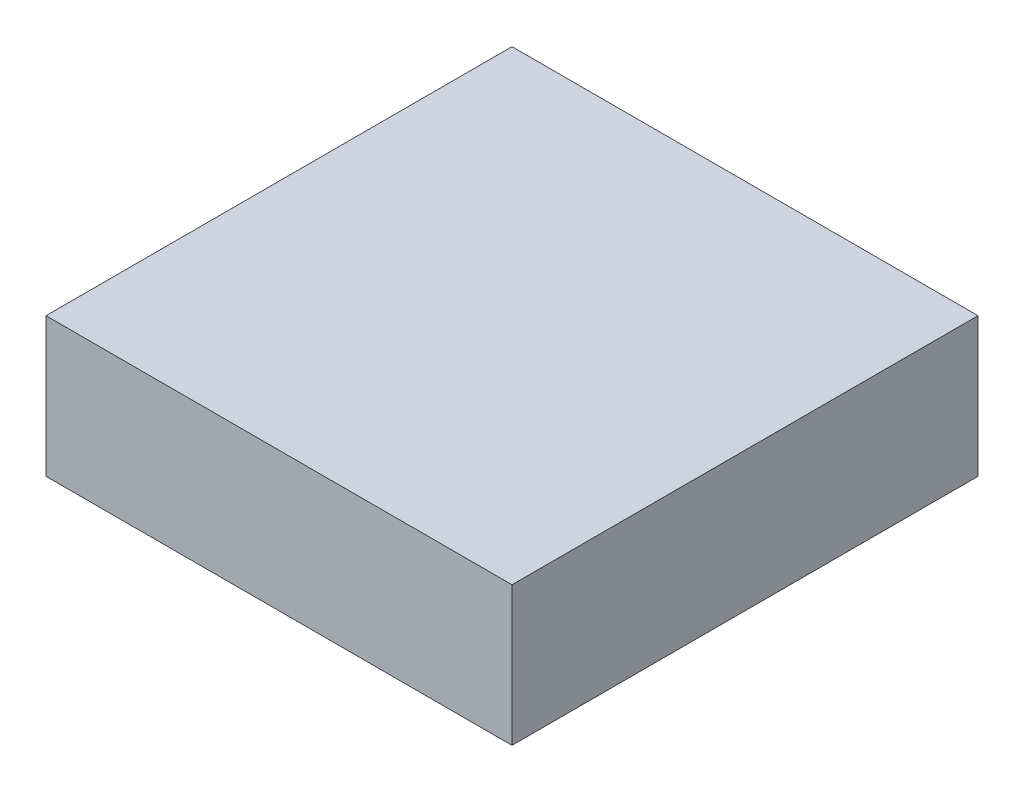
ISO-10303-21;
HEADER;
FILE_DESCRIPTION(('STEP AP214'),'2;1');
FILE_NAME('part.step','',(''),(''),'','','');
FILE_SCHEMA(('AUTOMOTIVE_DESIGN { 1 0 10303 214 1 1 1 1 }'));
ENDSEC;
DATA;
#1=APPLICATION_CONTEXT('core data for automotive mechanical design processes');
#2=APPLICATION_PROTOCOL_DEFINITION('international standard','automotive_design',2000,#1);
#3=PRODUCT_CONTEXT('',#1,'mechanical');
#4=PRODUCT('Part','Part','',(#3));
#5=PRODUCT_RELATED_PRODUCT_CATEGORY('part','',(#4));
#6=PRODUCT_DEFINITION_FORMATION('','',#4);
#7=PRODUCT_DEFINITION_CONTEXT('part definition',#1,'design');
#8=PRODUCT_DEFINITION('design','',#6,#7);
#9=PRODUCT_DEFINITION_SHAPE('','',#8);
#10=(LENGTH_UNIT() NAMED_UNIT(*) SI_UNIT(.MILLI.,.METRE.));
#11=(NAMED_UNIT(*) PLANE_ANGLE_UNIT() SI_UNIT($,.RADIAN.));
#12=(NAMED_UNIT(*) SI_UNIT($,.STERADIAN.) SOLID_ANGLE_UNIT());
#13=UNCERTAINTY_MEASURE_WITH_UNIT(LENGTH_MEASURE(1.E-05),#10,'distance_accuracy_value','');
#14=(GEOMETRIC_REPRESENTATION_CONTEXT(3) GLOBAL_UNCERTAINTY_ASSIGNED_CONTEXT((#13)) GLOBAL_UNIT_ASSIGNED_CONTEXT((#10,
#11,#12)) REPRESENTATION_CONTEXT('',''));
#15=CARTESIAN_POINT('',(0.,0.,0.));
#16=DIRECTION('',(0.,0.,1.));
#17=DIRECTION('',(1.,0.,0.));
#18=AXIS2_PLACEMENT_3D('',#15,#16,#17);
#19=CARTESIAN_POINT('',(0.,50.8,0.));
#20=DIRECTION('',(1.,0.,0.));
#21=DIRECTION('',(0.,0.,-1.));
#22=AXIS2_PLACEMENT_3D('',#19,#20,#21);
#23=PLANE('',#22);
#24=DIRECTION('',(0.,0.,1.));
#25=VECTOR('',#24,1.);
#26=CARTESIAN_POINT('',(0.,0.,0.));
#27=LINE('',#26,#25);
#28=CARTESIAN_POINT('',(0.,0.,-170.18));
#29=VERTEX_POINT('',#28);
#30=CARTESIAN_POINT('',(0.,0.,0.));
#31=VERTEX_POINT('',#30);
#32=EDGE_CURVE('E96',#29,#31,#27,.T.);
#33=ORIENTED_EDGE('',*,*,#32,.T.);
#34=DIRECTION('',(0.,-1.,0.));
#35=VECTOR('',#34,1.);
#36=CARTESIAN_POINT('',(0.,50.8,0.));
#37=LINE('',#36,#35);
#38=CARTESIAN_POINT('',(0.,50.8,0.));
#39=VERTEX_POINT('',#38);
#40=EDGE_CURVE('E11',#39,#31,#37,.T.);
#41=ORIENTED_EDGE('',*,*,#40,.F.);
#42=DIRECTION('',(0.,0.,1.));
#43=VECTOR('',#42,1.);
#44=CARTESIAN_POINT('',(0.,50.8,0.));
#45=LINE('',#44,#43);
#46=CARTESIAN_POINT('',(0.,50.8,-170.18));
#47=VERTEX_POINT('',#46);
#48=EDGE_CURVE('E84',#47,#39,#45,.T.);
#49=ORIENTED_EDGE('',*,*,#48,.F.);
#50=DIRECTION('',(0.,-1.,0.));
#51=VECTOR('',#50,1.);
#52=CARTESIAN_POINT('',(0.,50.8,-170.18));
#53=LINE('',#52,#51);
#54=EDGE_CURVE('E92',#47,#29,#53,.T.);
#55=ORIENTED_EDGE('',*,*,#54,.T.);
#56=EDGE_LOOP('',(#33,#41,#49,#55));
#57=FACE_BOUND('',#56,.T.);
#58=ADVANCED_FACE('F33',(#57),#23,.F.);
#59=CARTESIAN_POINT('',(0.,50.8,0.));
#60=DIRECTION('',(0.,0.,-1.));
#61=DIRECTION('',(-1.,0.,0.));
#62=AXIS2_PLACEMENT_3D('',#59,#60,#61);
#63=PLANE('',#62);
#64=DIRECTION('',(1.,0.,0.));
#65=VECTOR('',#64,1.);
#66=CARTESIAN_POINT('',(0.,0.,0.));
#67=LINE('',#66,#65);
#68=CARTESIAN_POINT('',(170.18,0.,0.));
#69=VERTEX_POINT('',#68);
#70=EDGE_CURVE('E88',#31,#69,#67,.T.);
#71=ORIENTED_EDGE('',*,*,#70,.T.);
#72=DIRECTION('',(0.,-1.,0.));
#73=VECTOR('',#72,1.);
#74=CARTESIAN_POINT('',(170.18,50.8,0.));
#75=LINE('',#74,#73);
#76=CARTESIAN_POINT('',(170.18,50.8,0.));
#77=VERTEX_POINT('',#76);
#78=EDGE_CURVE('E41',#77,#69,#75,.T.);
#79=ORIENTED_EDGE('',*,*,#78,.F.);
#80=DIRECTION('',(1.,0.,0.));
#81=VECTOR('',#80,1.);
#82=CARTESIAN_POINT('',(0.,50.8,0.));
#83=LINE('',#82,#81);
#84=EDGE_CURVE('E79',#39,#77,#83,.T.);
#85=ORIENTED_EDGE('',*,*,#84,.F.);
#86=ORIENTED_EDGE('',*,*,#40,.T.);
#87=EDGE_LOOP('',(#71,#79,#85,#86));
#88=FACE_BOUND('',#87,.T.);
#89=ADVANCED_FACE('F87',(#88),#63,.F.);
#90=CARTESIAN_POINT('',(170.18,50.8,0.));
#91=DIRECTION('',(-1.,0.,0.));
#92=DIRECTION('',(0.,0.,1.));
#93=AXIS2_PLACEMENT_3D('',#90,#91,#92);
#94=PLANE('',#93);
#95=DIRECTION('',(0.,0.,-1.));
#96=VECTOR('',#95,1.);
#97=CARTESIAN_POINT('',(170.18,0.,0.));
#98=LINE('',#97,#96);
#99=CARTESIAN_POINT('',(170.18,0.,-170.18));
#100=VERTEX_POINT('',#99);
#101=EDGE_CURVE('E66',#69,#100,#98,.T.);
#102=ORIENTED_EDGE('',*,*,#101,.T.);
#103=DIRECTION('',(0.,-1.,0.));
#104=VECTOR('',#103,1.);
#105=CARTESIAN_POINT('',(170.18,50.8,-170.18));
#106=LINE('',#105,#104);
#107=CARTESIAN_POINT('',(170.18,50.8,-170.18));
#108=VERTEX_POINT('',#107);
#109=EDGE_CURVE('E89',#108,#100,#106,.T.);
#110=ORIENTED_EDGE('',*,*,#109,.F.);
#111=DIRECTION('',(0.,0.,-1.));
#112=VECTOR('',#111,1.);
#113=CARTESIAN_POINT('',(170.18,50.8,0.));
#114=LINE('',#113,#112);
#115=EDGE_CURVE('E82',#77,#108,#114,.T.);
#116=ORIENTED_EDGE('',*,*,#115,.F.);
#117=ORIENTED_EDGE('',*,*,#78,.T.);
#118=EDGE_LOOP('',(#102,#110,#116,#117));
#119=FACE_BOUND('',#118,.T.);
#120=ADVANCED_FACE('F90',(#119),#94,.F.);
#121=CARTESIAN_POINT('',(0.,50.8,-170.18));
#122=DIRECTION('',(0.,0.,1.));
#123=DIRECTION('',(1.,0.,0.));
#124=AXIS2_PLACEMENT_3D('',#121,#122,#123);
#125=PLANE('',#124);
#126=DIRECTION('',(-1.,0.,0.));
#127=VECTOR('',#126,1.);
#128=CARTESIAN_POINT('',(0.,0.,-170.18));
#129=LINE('',#128,#127);
#130=EDGE_CURVE('E72',#100,#29,#129,.T.);
#131=ORIENTED_EDGE('',*,*,#130,.T.);
#132=ORIENTED_EDGE('',*,*,#54,.F.);
#133=DIRECTION('',(-1.,0.,0.));
#134=VECTOR('',#133,1.);
#135=CARTESIAN_POINT('',(0.,50.8,-170.18));
#136=LINE('',#135,#134);
#137=EDGE_CURVE('E49',#108,#47,#136,.T.);
#138=ORIENTED_EDGE('',*,*,#137,.F.);
#139=ORIENTED_EDGE('',*,*,#109,.T.);
#140=EDGE_LOOP('',(#131,#132,#138,#139));
#141=FACE_BOUND('',#140,.T.);
#142=ADVANCED_FACE('F103',(#141),#125,.F.);
#143=CARTESIAN_POINT('',(0.,50.8,0.));
#144=DIRECTION('',(0.,-1.,0.));
#145=DIRECTION('',(0.,0.,-1.));
#146=AXIS2_PLACEMENT_3D('',#143,#144,#145);
#147=PLANE('',#146);
#148=ORIENTED_EDGE('',*,*,#48,.T.);
#149=ORIENTED_EDGE('',*,*,#84,.T.);
#150=ORIENTED_EDGE('',*,*,#115,.T.);
#151=ORIENTED_EDGE('',*,*,#137,.T.);
#152=EDGE_LOOP('',(#148,#149,#150,#151));
#153=FACE_BOUND('',#152,.T.);
#154=ADVANCED_FACE('F80',(#153),#147,.F.);
#155=CARTESIAN_POINT('',(0.,0.,0.));
#156=DIRECTION('',(0.,-1.,0.));
#157=DIRECTION('',(0.,0.,-1.));
#158=AXIS2_PLACEMENT_3D('',#155,#156,#157);
#159=PLANE('',#158);
#160=ORIENTED_EDGE('',*,*,#32,.F.);
#161=ORIENTED_EDGE('',*,*,#130,.F.);
#162=ORIENTED_EDGE('',*,*,#101,.F.);
#163=ORIENTED_EDGE('',*,*,#70,.F.);
#164=EDGE_LOOP('',(#160,#161,#162,#163));
#165=FACE_BOUND('',#164,.T.);
#166=ADVANCED_FACE('F106',(#165),#159,.T.);
#167=CLOSED_SHELL('',(#58,#89,#120,#142,#154,#166));
#168=MANIFOLD_SOLID_BREP('B2',#167);
#169=ADVANCED_BREP_SHAPE_REPRESENTATION('',(#18,#168),#14);
#170=SHAPE_DEFINITION_REPRESENTATION(#9,#169);
ENDSEC;
END-ISO-10303-21;
